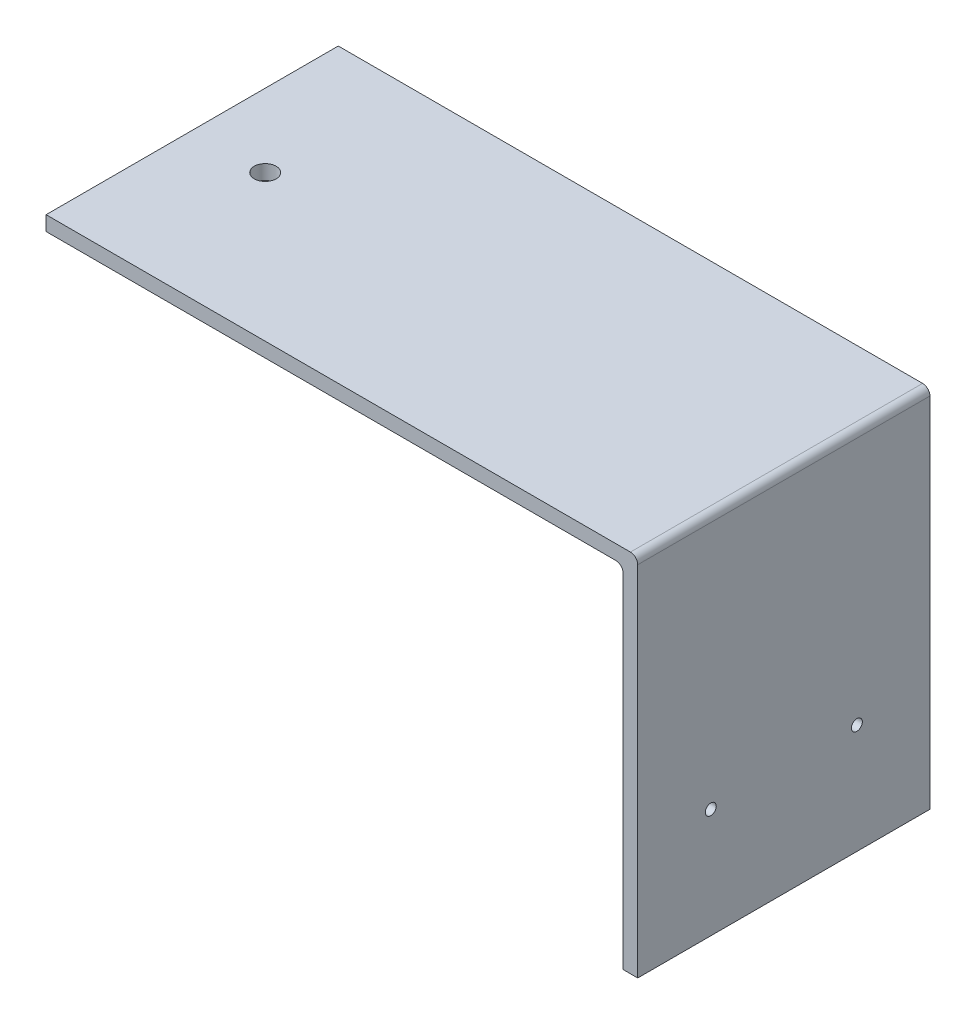
ISO-10303-21;
HEADER;
FILE_DESCRIPTION(('STEP AP214'),'2;1');
FILE_NAME('part.step','',(''),(''),'','','');
FILE_SCHEMA(('AUTOMOTIVE_DESIGN { 1 0 10303 214 1 1 1 1 }'));
ENDSEC;
DATA;
#1=APPLICATION_CONTEXT('core data for automotive mechanical design processes');
#2=APPLICATION_PROTOCOL_DEFINITION('international standard','automotive_design',2000,#1);
#3=PRODUCT_CONTEXT('',#1,'mechanical');
#4=PRODUCT('Part','Part','',(#3));
#5=PRODUCT_RELATED_PRODUCT_CATEGORY('part','',(#4));
#6=PRODUCT_DEFINITION_FORMATION('','',#4);
#7=PRODUCT_DEFINITION_CONTEXT('part definition',#1,'design');
#8=PRODUCT_DEFINITION('design','',#6,#7);
#9=PRODUCT_DEFINITION_SHAPE('','',#8);
#10=(LENGTH_UNIT() NAMED_UNIT(*) SI_UNIT(.MILLI.,.METRE.));
#11=(NAMED_UNIT(*) PLANE_ANGLE_UNIT() SI_UNIT($,.RADIAN.));
#12=(NAMED_UNIT(*) SI_UNIT($,.STERADIAN.) SOLID_ANGLE_UNIT());
#13=UNCERTAINTY_MEASURE_WITH_UNIT(LENGTH_MEASURE(1.E-05),#10,'distance_accuracy_value','');
#14=(GEOMETRIC_REPRESENTATION_CONTEXT(3) GLOBAL_UNCERTAINTY_ASSIGNED_CONTEXT((#13)) GLOBAL_UNIT_ASSIGNED_CONTEXT((#10,
#11,#12)) REPRESENTATION_CONTEXT('',''));
#15=CARTESIAN_POINT('',(0.,0.,0.));
#16=DIRECTION('',(0.,0.,1.));
#17=DIRECTION('',(1.,0.,0.));
#18=AXIS2_PLACEMENT_3D('',#15,#16,#17);
#19=CARTESIAN_POINT('',(0.,0.,0.));
#20=DIRECTION('',(0.,-1.,0.));
#21=DIRECTION('',(0.,0.,-1.));
#22=AXIS2_PLACEMENT_3D('',#19,#20,#21);
#23=PLANE('',#22);
#24=CARTESIAN_POINT('',(10.,0.,-20.));
#25=DIRECTION('',(0.,1.,0.));
#26=DIRECTION('',(0.,0.,1.));
#27=AXIS2_PLACEMENT_3D('',#24,#25,#26);
#28=CIRCLE('',#27,1.5);
#29=CARTESIAN_POINT('',(10.,0.,-18.5));
#30=VERTEX_POINT('',#29);
#31=EDGE_CURVE('E131',#30,#30,#28,.T.);
#32=ORIENTED_EDGE('',*,*,#31,.T.);
#33=EDGE_LOOP('',(#32));
#34=FACE_BOUND('',#33,.T.);
#35=DIRECTION('',(-1.,0.,0.));
#36=VECTOR('',#35,1.);
#37=CARTESIAN_POINT('',(0.,0.,-40.));
#38=LINE('',#37,#36);
#39=CARTESIAN_POINT('',(78.,0.,-40.));
#40=VERTEX_POINT('',#39);
#41=CARTESIAN_POINT('',(0.,0.,-40.));
#42=VERTEX_POINT('',#41);
#43=EDGE_CURVE('E145',#40,#42,#38,.T.);
#44=ORIENTED_EDGE('',*,*,#43,.F.);
#45=DIRECTION('',(0.,0.,1.));
#46=VECTOR('',#45,1.);
#47=CARTESIAN_POINT('',(78.,0.,0.));
#48=LINE('',#47,#46);
#49=CARTESIAN_POINT('',(78.,0.,0.));
#50=VERTEX_POINT('',#49);
#51=EDGE_CURVE('E161',#40,#50,#48,.T.);
#52=ORIENTED_EDGE('',*,*,#51,.T.);
#53=DIRECTION('',(1.,0.,0.));
#54=VECTOR('',#53,1.);
#55=CARTESIAN_POINT('',(0.,0.,0.));
#56=LINE('',#55,#54);
#57=CARTESIAN_POINT('',(0.,0.,0.));
#58=VERTEX_POINT('',#57);
#59=EDGE_CURVE('E153',#58,#50,#56,.T.);
#60=ORIENTED_EDGE('',*,*,#59,.F.);
#61=DIRECTION('',(0.,0.,1.));
#62=VECTOR('',#61,1.);
#63=CARTESIAN_POINT('',(0.,0.,0.));
#64=LINE('',#63,#62);
#65=EDGE_CURVE('E138',#42,#58,#64,.T.);
#66=ORIENTED_EDGE('',*,*,#65,.F.);
#67=EDGE_LOOP('',(#44,#52,#60,#66));
#68=FACE_BOUND('',#67,.T.);
#69=ADVANCED_FACE('F36',(#34,#68),#23,.T.);
#70=CARTESIAN_POINT('',(0.,2.,0.));
#71=DIRECTION('',(0.,-1.,0.));
#72=DIRECTION('',(0.,0.,-1.));
#73=AXIS2_PLACEMENT_3D('',#70,#71,#72);
#74=PLANE('',#73);
#75=DIRECTION('',(1.,0.,0.));
#76=VECTOR('',#75,1.);
#77=CARTESIAN_POINT('',(0.,2.,0.));
#78=LINE('',#77,#76);
#79=CARTESIAN_POINT('',(0.,2.,0.));
#80=VERTEX_POINT('',#79);
#81=CARTESIAN_POINT('',(80.,2.,0.));
#82=VERTEX_POINT('',#81);
#83=EDGE_CURVE('E144',#80,#82,#78,.T.);
#84=ORIENTED_EDGE('',*,*,#83,.T.);
#85=DIRECTION('',(0.,0.,-1.));
#86=VECTOR('',#85,1.);
#87=CARTESIAN_POINT('',(80.,2.,-40.));
#88=LINE('',#87,#86);
#89=CARTESIAN_POINT('',(80.,2.,-40.));
#90=VERTEX_POINT('',#89);
#91=EDGE_CURVE('E172',#82,#90,#88,.T.);
#92=ORIENTED_EDGE('',*,*,#91,.T.);
#93=DIRECTION('',(-1.,0.,0.));
#94=VECTOR('',#93,1.);
#95=CARTESIAN_POINT('',(0.,2.,-40.));
#96=LINE('',#95,#94);
#97=CARTESIAN_POINT('',(0.,2.,-40.));
#98=VERTEX_POINT('',#97);
#99=EDGE_CURVE('E148',#90,#98,#96,.T.);
#100=ORIENTED_EDGE('',*,*,#99,.T.);
#101=DIRECTION('',(0.,0.,1.));
#102=VECTOR('',#101,1.);
#103=CARTESIAN_POINT('',(0.,2.,0.));
#104=LINE('',#103,#102);
#105=EDGE_CURVE('E141',#98,#80,#104,.T.);
#106=ORIENTED_EDGE('',*,*,#105,.T.);
#107=EDGE_LOOP('',(#84,#92,#100,#106));
#108=FACE_BOUND('',#107,.T.);
#109=CARTESIAN_POINT('',(10.,2.,-20.));
#110=DIRECTION('',(0.,1.,0.));
#111=DIRECTION('',(0.,0.,1.));
#112=AXIS2_PLACEMENT_3D('',#109,#110,#111);
#113=CIRCLE('',#112,1.5);
#114=CARTESIAN_POINT('',(10.,2.,-18.5));
#115=VERTEX_POINT('',#114);
#116=EDGE_CURVE('E135',#115,#115,#113,.T.);
#117=ORIENTED_EDGE('',*,*,#116,.F.);
#118=EDGE_LOOP('',(#117));
#119=FACE_BOUND('',#118,.T.);
#120=ADVANCED_FACE('F182',(#108,#119),#74,.F.);
#121=CARTESIAN_POINT('',(0.,2.,0.));
#122=DIRECTION('',(1.,0.,0.));
#123=DIRECTION('',(0.,0.,-1.));
#124=AXIS2_PLACEMENT_3D('',#121,#122,#123);
#125=PLANE('',#124);
#126=ORIENTED_EDGE('',*,*,#65,.T.);
#127=DIRECTION('',(0.,-1.,0.));
#128=VECTOR('',#127,1.);
#129=CARTESIAN_POINT('',(0.,2.,0.));
#130=LINE('',#129,#128);
#131=EDGE_CURVE('E158',#80,#58,#130,.T.);
#132=ORIENTED_EDGE('',*,*,#131,.F.);
#133=ORIENTED_EDGE('',*,*,#105,.F.);
#134=DIRECTION('',(0.,-1.,0.));
#135=VECTOR('',#134,1.);
#136=CARTESIAN_POINT('',(0.,2.,-40.));
#137=LINE('',#136,#135);
#138=EDGE_CURVE('E150',#98,#42,#137,.T.);
#139=ORIENTED_EDGE('',*,*,#138,.T.);
#140=EDGE_LOOP('',(#126,#132,#133,#139));
#141=FACE_BOUND('',#140,.T.);
#142=ADVANCED_FACE('F199',(#141),#125,.F.);
#143=CARTESIAN_POINT('',(0.,2.,0.));
#144=DIRECTION('',(0.,0.,-1.));
#145=DIRECTION('',(-1.,0.,0.));
#146=AXIS2_PLACEMENT_3D('',#143,#144,#145);
#147=PLANE('',#146);
#148=DIRECTION('',(0.,1.,0.));
#149=VECTOR('',#148,1.);
#150=CARTESIAN_POINT('',(81.,-48.,0.));
#151=LINE('',#150,#149);
#152=CARTESIAN_POINT('',(81.,-48.,0.));
#153=VERTEX_POINT('',#152);
#154=CARTESIAN_POINT('',(81.,1.,0.));
#155=VERTEX_POINT('',#154);
#156=EDGE_CURVE('E108',#153,#155,#151,.T.);
#157=ORIENTED_EDGE('',*,*,#156,.T.);
#158=CARTESIAN_POINT('',(80.,1.,0.));
#159=DIRECTION('',(0.,0.,-1.));
#160=DIRECTION('',(-1.,0.,0.));
#161=AXIS2_PLACEMENT_3D('',#158,#159,#160);
#162=CIRCLE('',#161,1.);
#163=EDGE_CURVE('E177',#155,#82,#162,.F.);
#164=ORIENTED_EDGE('',*,*,#163,.T.);
#165=ORIENTED_EDGE('',*,*,#83,.F.);
#166=ORIENTED_EDGE('',*,*,#131,.T.);
#167=ORIENTED_EDGE('',*,*,#59,.T.);
#168=CARTESIAN_POINT('',(78.,-1.,0.));
#169=DIRECTION('',(0.,0.,-1.));
#170=DIRECTION('',(-1.,0.,0.));
#171=AXIS2_PLACEMENT_3D('',#168,#169,#170);
#172=CIRCLE('',#171,1.);
#173=CARTESIAN_POINT('',(79.,-1.,0.));
#174=VERTEX_POINT('',#173);
#175=EDGE_CURVE('E44',#50,#174,#172,.T.);
#176=ORIENTED_EDGE('',*,*,#175,.T.);
#177=DIRECTION('',(0.,1.,0.));
#178=VECTOR('',#177,1.);
#179=CARTESIAN_POINT('',(79.,-48.,0.));
#180=LINE('',#179,#178);
#181=CARTESIAN_POINT('',(79.,-48.,0.));
#182=VERTEX_POINT('',#181);
#183=EDGE_CURVE('E100',#182,#174,#180,.T.);
#184=ORIENTED_EDGE('',*,*,#183,.F.);
#185=DIRECTION('',(1.,0.,0.));
#186=VECTOR('',#185,1.);
#187=CARTESIAN_POINT('',(0.,-48.,0.));
#188=LINE('',#187,#186);
#189=EDGE_CURVE('E104',#182,#153,#188,.T.);
#190=ORIENTED_EDGE('',*,*,#189,.T.);
#191=EDGE_LOOP('',(#157,#164,#165,#166,#167,#176,#184,#190));
#192=FACE_BOUND('',#191,.T.);
#193=ADVANCED_FACE('F102',(#192),#147,.F.);
#194=CARTESIAN_POINT('',(0.,2.,-40.));
#195=DIRECTION('',(0.,0.,1.));
#196=DIRECTION('',(1.,0.,0.));
#197=AXIS2_PLACEMENT_3D('',#194,#195,#196);
#198=PLANE('',#197);
#199=ORIENTED_EDGE('',*,*,#99,.F.);
#200=CARTESIAN_POINT('',(80.,1.,-40.));
#201=DIRECTION('',(0.,0.,1.));
#202=DIRECTION('',(1.,0.,0.));
#203=AXIS2_PLACEMENT_3D('',#200,#201,#202);
#204=CIRCLE('',#203,1.);
#205=CARTESIAN_POINT('',(81.,1.,-40.));
#206=VERTEX_POINT('',#205);
#207=EDGE_CURVE('E59',#90,#206,#204,.F.);
#208=ORIENTED_EDGE('',*,*,#207,.T.);
#209=DIRECTION('',(0.,1.,0.));
#210=VECTOR('',#209,1.);
#211=CARTESIAN_POINT('',(81.,-48.,-40.));
#212=LINE('',#211,#210);
#213=CARTESIAN_POINT('',(81.,-48.,-40.));
#214=VERTEX_POINT('',#213);
#215=EDGE_CURVE('E132',#214,#206,#212,.T.);
#216=ORIENTED_EDGE('',*,*,#215,.F.);
#217=DIRECTION('',(-1.,0.,0.));
#218=VECTOR('',#217,1.);
#219=CARTESIAN_POINT('',(0.,-48.,-40.));
#220=LINE('',#219,#218);
#221=CARTESIAN_POINT('',(79.,-48.,-40.));
#222=VERTEX_POINT('',#221);
#223=EDGE_CURVE('E109',#214,#222,#220,.T.);
#224=ORIENTED_EDGE('',*,*,#223,.T.);
#225=DIRECTION('',(0.,1.,0.));
#226=VECTOR('',#225,1.);
#227=CARTESIAN_POINT('',(79.,-48.,-40.));
#228=LINE('',#227,#226);
#229=CARTESIAN_POINT('',(79.,-1.,-40.));
#230=VERTEX_POINT('',#229);
#231=EDGE_CURVE('E115',#222,#230,#228,.T.);
#232=ORIENTED_EDGE('',*,*,#231,.T.);
#233=CARTESIAN_POINT('',(78.,-1.,-40.));
#234=DIRECTION('',(0.,0.,1.));
#235=DIRECTION('',(1.,0.,0.));
#236=AXIS2_PLACEMENT_3D('',#233,#234,#235);
#237=CIRCLE('',#236,1.);
#238=EDGE_CURVE('E11',#230,#40,#237,.T.);
#239=ORIENTED_EDGE('',*,*,#238,.T.);
#240=ORIENTED_EDGE('',*,*,#43,.T.);
#241=ORIENTED_EDGE('',*,*,#138,.F.);
#242=EDGE_LOOP('',(#199,#208,#216,#224,#232,#239,#240,#241));
#243=FACE_BOUND('',#242,.T.);
#244=ADVANCED_FACE('F204',(#243),#198,.F.);
#245=CARTESIAN_POINT('',(10.,2.,-20.));
#246=DIRECTION('',(0.,-1.,0.));
#247=DIRECTION('',(0.,0.,-1.));
#248=AXIS2_PLACEMENT_3D('',#245,#246,#247);
#249=CYLINDRICAL_SURFACE('',#248,1.5);
#250=ORIENTED_EDGE('',*,*,#116,.T.);
#251=EDGE_LOOP('',(#250));
#252=FACE_BOUND('',#251,.T.);
#253=ORIENTED_EDGE('',*,*,#31,.F.);
#254=EDGE_LOOP('',(#253));
#255=FACE_BOUND('',#254,.T.);
#256=ADVANCED_FACE('F207',(#252,#255),#249,.F.);
#257=CARTESIAN_POINT('',(79.,-48.,0.));
#258=DIRECTION('',(1.,0.,0.));
#259=DIRECTION('',(0.,0.,-1.));
#260=AXIS2_PLACEMENT_3D('',#257,#258,#259);
#261=PLANE('',#260);
#262=CARTESIAN_POINT('',(79.,-33.,-30.));
#263=DIRECTION('',(-1.,0.,0.));
#264=DIRECTION('',(0.,0.,1.));
#265=AXIS2_PLACEMENT_3D('',#262,#263,#264);
#266=CIRCLE('',#265,0.750000000000002);
#267=CARTESIAN_POINT('',(79.,-33.,-29.25));
#268=VERTEX_POINT('',#267);
#269=EDGE_CURVE('E165',#268,#268,#266,.T.);
#270=ORIENTED_EDGE('',*,*,#269,.F.);
#271=EDGE_LOOP('',(#270));
#272=FACE_BOUND('',#271,.T.);
#273=CARTESIAN_POINT('',(79.,-33.,-10.));
#274=DIRECTION('',(-1.,0.,0.));
#275=DIRECTION('',(0.,0.,1.));
#276=AXIS2_PLACEMENT_3D('',#273,#274,#275);
#277=CIRCLE('',#276,0.75);
#278=CARTESIAN_POINT('',(79.,-33.,-9.25));
#279=VERTEX_POINT('',#278);
#280=EDGE_CURVE('E298',#279,#279,#277,.T.);
#281=ORIENTED_EDGE('',*,*,#280,.F.);
#282=EDGE_LOOP('',(#281));
#283=FACE_BOUND('',#282,.T.);
#284=ORIENTED_EDGE('',*,*,#183,.T.);
#285=DIRECTION('',(0.,0.,1.));
#286=VECTOR('',#285,1.);
#287=CARTESIAN_POINT('',(79.,-1.,0.));
#288=LINE('',#287,#286);
#289=EDGE_CURVE('E170',#174,#230,#288,.F.);
#290=ORIENTED_EDGE('',*,*,#289,.T.);
#291=ORIENTED_EDGE('',*,*,#231,.F.);
#292=DIRECTION('',(0.,0.,-1.));
#293=VECTOR('',#292,1.);
#294=CARTESIAN_POINT('',(79.,-48.,0.));
#295=LINE('',#294,#293);
#296=EDGE_CURVE('E112',#182,#222,#295,.T.);
#297=ORIENTED_EDGE('',*,*,#296,.F.);
#298=EDGE_LOOP('',(#284,#290,#291,#297));
#299=FACE_BOUND('',#298,.T.);
#300=ADVANCED_FACE('F113',(#272,#283,#299),#261,.F.);
#301=CARTESIAN_POINT('',(81.,-48.,0.));
#302=DIRECTION('',(1.,0.,0.));
#303=DIRECTION('',(0.,0.,-1.));
#304=AXIS2_PLACEMENT_3D('',#301,#302,#303);
#305=PLANE('',#304);
#306=CARTESIAN_POINT('',(81.,-33.,-30.));
#307=DIRECTION('',(1.,0.,0.));
#308=DIRECTION('',(0.,0.,-1.));
#309=AXIS2_PLACEMENT_3D('',#306,#307,#308);
#310=CIRCLE('',#309,0.750000000000002);
#311=CARTESIAN_POINT('',(81.,-33.,-30.75));
#312=VERTEX_POINT('',#311);
#313=EDGE_CURVE('E119',#312,#312,#310,.T.);
#314=ORIENTED_EDGE('',*,*,#313,.F.);
#315=EDGE_LOOP('',(#314));
#316=FACE_BOUND('',#315,.T.);
#317=CARTESIAN_POINT('',(81.,-33.,-10.));
#318=DIRECTION('',(1.,0.,0.));
#319=DIRECTION('',(0.,0.,-1.));
#320=AXIS2_PLACEMENT_3D('',#317,#318,#319);
#321=CIRCLE('',#320,0.75);
#322=CARTESIAN_POINT('',(81.,-33.,-10.75));
#323=VERTEX_POINT('',#322);
#324=EDGE_CURVE('E162',#323,#323,#321,.T.);
#325=ORIENTED_EDGE('',*,*,#324,.F.);
#326=EDGE_LOOP('',(#325));
#327=FACE_BOUND('',#326,.T.);
#328=ORIENTED_EDGE('',*,*,#215,.T.);
#329=DIRECTION('',(0.,0.,-1.));
#330=VECTOR('',#329,1.);
#331=CARTESIAN_POINT('',(81.,1.,0.));
#332=LINE('',#331,#330);
#333=EDGE_CURVE('E51',#206,#155,#332,.F.);
#334=ORIENTED_EDGE('',*,*,#333,.T.);
#335=ORIENTED_EDGE('',*,*,#156,.F.);
#336=DIRECTION('',(0.,0.,-1.));
#337=VECTOR('',#336,1.);
#338=CARTESIAN_POINT('',(81.,-48.,0.));
#339=LINE('',#338,#337);
#340=EDGE_CURVE('E124',#153,#214,#339,.T.);
#341=ORIENTED_EDGE('',*,*,#340,.T.);
#342=EDGE_LOOP('',(#328,#334,#335,#341));
#343=FACE_BOUND('',#342,.T.);
#344=ADVANCED_FACE('F219',(#316,#327,#343),#305,.T.);
#345=CARTESIAN_POINT('',(0.,-48.,0.));
#346=DIRECTION('',(0.,1.,0.));
#347=DIRECTION('',(0.,0.,1.));
#348=AXIS2_PLACEMENT_3D('',#345,#346,#347);
#349=PLANE('',#348);
#350=ORIENTED_EDGE('',*,*,#296,.T.);
#351=ORIENTED_EDGE('',*,*,#223,.F.);
#352=ORIENTED_EDGE('',*,*,#340,.F.);
#353=ORIENTED_EDGE('',*,*,#189,.F.);
#354=EDGE_LOOP('',(#350,#351,#352,#353));
#355=FACE_BOUND('',#354,.T.);
#356=ADVANCED_FACE('F122',(#355),#349,.F.);
#357=CARTESIAN_POINT('',(149.,-33.,-10.));
#358=DIRECTION('',(-1.,0.,0.));
#359=DIRECTION('',(0.,0.,1.));
#360=AXIS2_PLACEMENT_3D('',#357,#358,#359);
#361=CYLINDRICAL_SURFACE('',#360,0.75);
#362=ORIENTED_EDGE('',*,*,#324,.T.);
#363=EDGE_LOOP('',(#362));
#364=FACE_BOUND('',#363,.T.);
#365=ORIENTED_EDGE('',*,*,#280,.T.);
#366=EDGE_LOOP('',(#365));
#367=FACE_BOUND('',#366,.T.);
#368=ADVANCED_FACE('F227',(#364,#367),#361,.F.);
#369=CARTESIAN_POINT('',(149.,-33.,-30.));
#370=DIRECTION('',(-1.,0.,0.));
#371=DIRECTION('',(0.,0.,1.));
#372=AXIS2_PLACEMENT_3D('',#369,#370,#371);
#373=CYLINDRICAL_SURFACE('',#372,0.750000000000002);
#374=ORIENTED_EDGE('',*,*,#313,.T.);
#375=EDGE_LOOP('',(#374));
#376=FACE_BOUND('',#375,.T.);
#377=ORIENTED_EDGE('',*,*,#269,.T.);
#378=EDGE_LOOP('',(#377));
#379=FACE_BOUND('',#378,.T.);
#380=ADVANCED_FACE('F191',(#376,#379),#373,.F.);
#381=CARTESIAN_POINT('',(78.,-1.,0.));
#382=DIRECTION('',(0.,0.,1.));
#383=DIRECTION('',(1.,0.,0.));
#384=AXIS2_PLACEMENT_3D('',#381,#382,#383);
#385=CYLINDRICAL_SURFACE('',#384,1.);
#386=ORIENTED_EDGE('',*,*,#238,.F.);
#387=ORIENTED_EDGE('',*,*,#289,.F.);
#388=ORIENTED_EDGE('',*,*,#175,.F.);
#389=ORIENTED_EDGE('',*,*,#51,.F.);
#390=EDGE_LOOP('',(#386,#387,#388,#389));
#391=FACE_BOUND('',#390,.T.);
#392=ADVANCED_FACE('F187',(#391),#385,.F.);
#393=CARTESIAN_POINT('',(80.,1.,0.));
#394=DIRECTION('',(0.,0.,1.));
#395=DIRECTION('',(1.,0.,0.));
#396=AXIS2_PLACEMENT_3D('',#393,#394,#395);
#397=CYLINDRICAL_SURFACE('',#396,1.);
#398=ORIENTED_EDGE('',*,*,#163,.F.);
#399=ORIENTED_EDGE('',*,*,#333,.F.);
#400=ORIENTED_EDGE('',*,*,#207,.F.);
#401=ORIENTED_EDGE('',*,*,#91,.F.);
#402=EDGE_LOOP('',(#398,#399,#400,#401));
#403=FACE_BOUND('',#402,.T.);
#404=ADVANCED_FACE('F38',(#403),#397,.T.);
#405=CLOSED_SHELL('',(#69,#120,#142,#193,#244,#256,#300,#344,#356,#368,#380,#392,#404));
#406=MANIFOLD_SOLID_BREP('B2',#405);
#407=ADVANCED_BREP_SHAPE_REPRESENTATION('',(#18,#406),#14);
#408=SHAPE_DEFINITION_REPRESENTATION(#9,#407);
ENDSEC;
END-ISO-10303-21;
